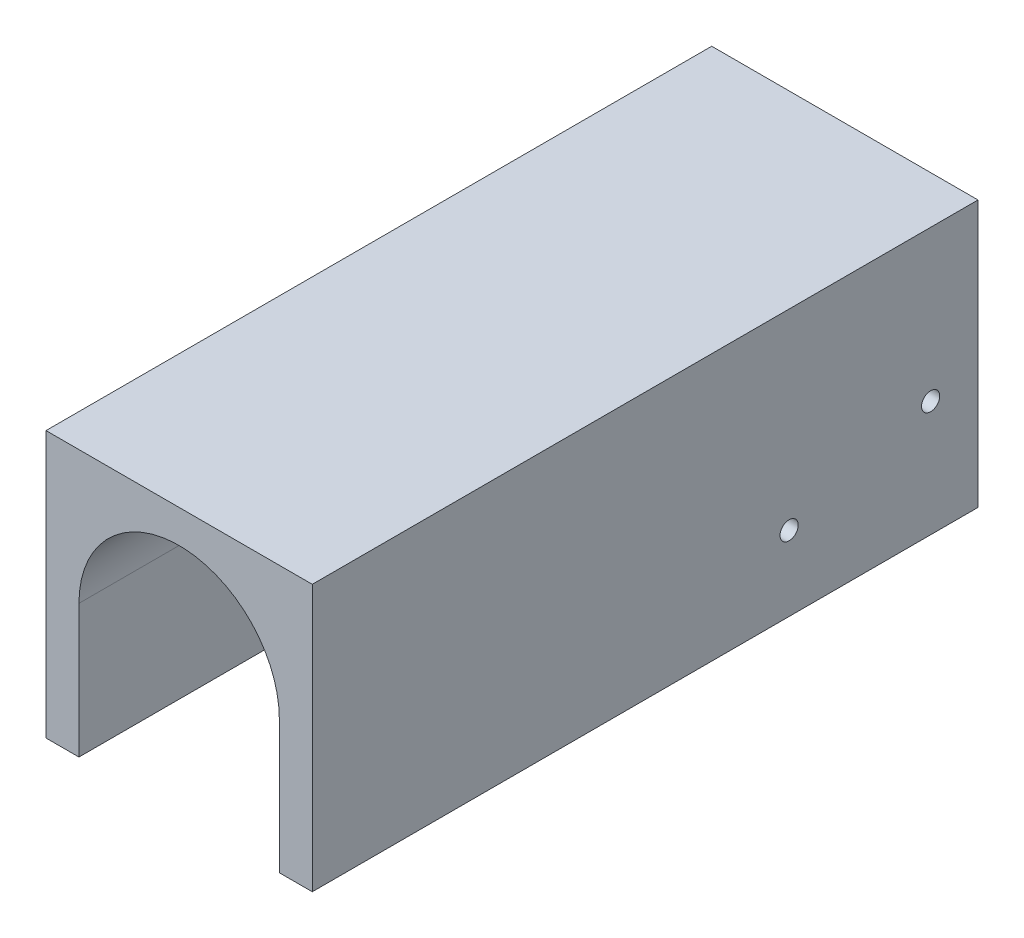
ISO-10303-21;
HEADER;
FILE_DESCRIPTION(('STEP AP214'),'2;1');
FILE_NAME('part.step','',(''),(''),'','','');
FILE_SCHEMA(('AUTOMOTIVE_DESIGN { 1 0 10303 214 1 1 1 1 }'));
ENDSEC;
DATA;
#1=APPLICATION_CONTEXT('core data for automotive mechanical design processes');
#2=APPLICATION_PROTOCOL_DEFINITION('international standard','automotive_design',2000,#1);
#3=PRODUCT_CONTEXT('',#1,'mechanical');
#4=PRODUCT('Part','Part','',(#3));
#5=PRODUCT_RELATED_PRODUCT_CATEGORY('part','',(#4));
#6=PRODUCT_DEFINITION_FORMATION('','',#4);
#7=PRODUCT_DEFINITION_CONTEXT('part definition',#1,'design');
#8=PRODUCT_DEFINITION('design','',#6,#7);
#9=PRODUCT_DEFINITION_SHAPE('','',#8);
#10=(LENGTH_UNIT() NAMED_UNIT(*) SI_UNIT(.MILLI.,.METRE.));
#11=(NAMED_UNIT(*) PLANE_ANGLE_UNIT() SI_UNIT($,.RADIAN.));
#12=(NAMED_UNIT(*) SI_UNIT($,.STERADIAN.) SOLID_ANGLE_UNIT());
#13=UNCERTAINTY_MEASURE_WITH_UNIT(LENGTH_MEASURE(1.E-05),#10,'distance_accuracy_value','');
#14=(GEOMETRIC_REPRESENTATION_CONTEXT(3) GLOBAL_UNCERTAINTY_ASSIGNED_CONTEXT((#13)) GLOBAL_UNIT_ASSIGNED_CONTEXT((#10,
#11,#12)) REPRESENTATION_CONTEXT('',''));
#15=CARTESIAN_POINT('',(0.,0.,0.));
#16=DIRECTION('',(0.,0.,1.));
#17=DIRECTION('',(1.,0.,0.));
#18=AXIS2_PLACEMENT_3D('',#15,#16,#17);
#19=CARTESIAN_POINT('',(30.,0.,0.));
#20=DIRECTION('',(0.,0.,-1.));
#21=DIRECTION('',(-1.,0.,0.));
#22=AXIS2_PLACEMENT_3D('',#19,#20,#21);
#23=PLANE('',#22);
#24=CARTESIAN_POINT('',(0.,-30.,0.));
#25=DIRECTION('',(0.,0.,1.));
#26=DIRECTION('',(1.,0.,0.));
#27=AXIS2_PLACEMENT_3D('',#24,#25,#26);
#28=CIRCLE('',#27,22.575);
#29=CARTESIAN_POINT('',(22.575,-30.,0.));
#30=VERTEX_POINT('',#29);
#31=CARTESIAN_POINT('',(-22.575,-30.,0.));
#32=VERTEX_POINT('',#31);
#33=EDGE_CURVE('E112',#30,#32,#28,.T.);
#34=ORIENTED_EDGE('',*,*,#33,.F.);
#35=DIRECTION('',(0.,1.,0.));
#36=VECTOR('',#35,1.);
#37=CARTESIAN_POINT('',(22.575,-60.,0.));
#38=LINE('',#37,#36);
#39=CARTESIAN_POINT('',(22.575,-60.,0.));
#40=VERTEX_POINT('',#39);
#41=EDGE_CURVE('E125',#40,#30,#38,.T.);
#42=ORIENTED_EDGE('',*,*,#41,.F.);
#43=DIRECTION('',(-1.,0.,0.));
#44=VECTOR('',#43,1.);
#45=CARTESIAN_POINT('',(30.,-60.,0.));
#46=LINE('',#45,#44);
#47=CARTESIAN_POINT('',(30.,-60.,0.));
#48=VERTEX_POINT('',#47);
#49=EDGE_CURVE('E11',#48,#40,#46,.T.);
#50=ORIENTED_EDGE('',*,*,#49,.F.);
#51=DIRECTION('',(0.,-1.,0.));
#52=VECTOR('',#51,1.);
#53=CARTESIAN_POINT('',(30.,0.,0.));
#54=LINE('',#53,#52);
#55=CARTESIAN_POINT('',(30.,0.,0.));
#56=VERTEX_POINT('',#55);
#57=EDGE_CURVE('E144',#56,#48,#54,.T.);
#58=ORIENTED_EDGE('',*,*,#57,.F.);
#59=DIRECTION('',(-1.,0.,0.));
#60=VECTOR('',#59,1.);
#61=CARTESIAN_POINT('',(30.,0.,0.));
#62=LINE('',#61,#60);
#63=CARTESIAN_POINT('',(-30.,0.,0.));
#64=VERTEX_POINT('',#63);
#65=EDGE_CURVE('E150',#56,#64,#62,.T.);
#66=ORIENTED_EDGE('',*,*,#65,.T.);
#67=DIRECTION('',(0.,-1.,0.));
#68=VECTOR('',#67,1.);
#69=CARTESIAN_POINT('',(-30.,0.,0.));
#70=LINE('',#69,#68);
#71=CARTESIAN_POINT('',(-30.,-60.,0.));
#72=VERTEX_POINT('',#71);
#73=EDGE_CURVE('E140',#64,#72,#70,.T.);
#74=ORIENTED_EDGE('',*,*,#73,.T.);
#75=CARTESIAN_POINT('',(-22.575,-60.,0.));
#76=VERTEX_POINT('',#75);
#77=EDGE_CURVE('E40',#76,#72,#46,.T.);
#78=ORIENTED_EDGE('',*,*,#77,.F.);
#79=DIRECTION('',(0.,-1.,0.));
#80=VECTOR('',#79,1.);
#81=CARTESIAN_POINT('',(-22.575,-30.,0.));
#82=LINE('',#81,#80);
#83=EDGE_CURVE('E128',#32,#76,#82,.T.);
#84=ORIENTED_EDGE('',*,*,#83,.F.);
#85=EDGE_LOOP('',(#34,#42,#50,#58,#66,#74,#78,#84));
#86=FACE_BOUND('',#85,.T.);
#87=ADVANCED_FACE('F33',(#86),#23,.F.);
#88=CARTESIAN_POINT('',(30.,-60.,0.));
#89=DIRECTION('',(0.,1.,0.));
#90=DIRECTION('',(0.,0.,1.));
#91=AXIS2_PLACEMENT_3D('',#88,#89,#90);
#92=PLANE('',#91);
#93=ORIENTED_EDGE('',*,*,#49,.T.);
#94=DIRECTION('',(0.,0.,1.));
#95=VECTOR('',#94,1.);
#96=CARTESIAN_POINT('',(22.575,-60.,-100.));
#97=LINE('',#96,#95);
#98=CARTESIAN_POINT('',(22.575,-60.,-100.));
#99=VERTEX_POINT('',#98);
#100=EDGE_CURVE('E141',#99,#40,#97,.T.);
#101=ORIENTED_EDGE('',*,*,#100,.F.);
#102=DIRECTION('',(1.,0.,0.));
#103=VECTOR('',#102,1.);
#104=CARTESIAN_POINT('',(-22.575,-60.,-100.));
#105=LINE('',#104,#103);
#106=CARTESIAN_POINT('',(-22.575,-60.,-100.));
#107=VERTEX_POINT('',#106);
#108=EDGE_CURVE('E121',#107,#99,#105,.T.);
#109=ORIENTED_EDGE('',*,*,#108,.F.);
#110=DIRECTION('',(0.,0.,1.));
#111=VECTOR('',#110,1.);
#112=CARTESIAN_POINT('',(-22.575,-60.,-100.));
#113=LINE('',#112,#111);
#114=EDGE_CURVE('E115',#107,#76,#113,.T.);
#115=ORIENTED_EDGE('',*,*,#114,.T.);
#116=ORIENTED_EDGE('',*,*,#77,.T.);
#117=DIRECTION('',(0.,0.,-1.));
#118=VECTOR('',#117,1.);
#119=CARTESIAN_POINT('',(-30.,-60.,0.));
#120=LINE('',#119,#118);
#121=CARTESIAN_POINT('',(-30.,-60.,-150.));
#122=VERTEX_POINT('',#121);
#123=EDGE_CURVE('E153',#72,#122,#120,.T.);
#124=ORIENTED_EDGE('',*,*,#123,.T.);
#125=DIRECTION('',(-1.,0.,0.));
#126=VECTOR('',#125,1.);
#127=CARTESIAN_POINT('',(30.,-60.,-150.));
#128=LINE('',#127,#126);
#129=CARTESIAN_POINT('',(30.,-60.,-150.));
#130=VERTEX_POINT('',#129);
#131=EDGE_CURVE('E160',#130,#122,#128,.T.);
#132=ORIENTED_EDGE('',*,*,#131,.F.);
#133=DIRECTION('',(0.,0.,-1.));
#134=VECTOR('',#133,1.);
#135=CARTESIAN_POINT('',(30.,-60.,0.));
#136=LINE('',#135,#134);
#137=EDGE_CURVE('E84',#48,#130,#136,.T.);
#138=ORIENTED_EDGE('',*,*,#137,.F.);
#139=EDGE_LOOP('',(#93,#101,#109,#115,#116,#124,#132,#138));
#140=FACE_BOUND('',#139,.T.);
#141=ADVANCED_FACE('F167',(#140),#92,.F.);
#142=CARTESIAN_POINT('',(30.,0.,-150.));
#143=DIRECTION('',(0.,0.,1.));
#144=DIRECTION('',(1.,0.,0.));
#145=AXIS2_PLACEMENT_3D('',#142,#143,#144);
#146=PLANE('',#145);
#147=DIRECTION('',(0.,1.,0.));
#148=VECTOR('',#147,1.);
#149=CARTESIAN_POINT('',(-30.,0.,-150.));
#150=LINE('',#149,#148);
#151=CARTESIAN_POINT('',(-30.,0.,-150.));
#152=VERTEX_POINT('',#151);
#153=EDGE_CURVE('E155',#122,#152,#150,.T.);
#154=ORIENTED_EDGE('',*,*,#153,.T.);
#155=DIRECTION('',(-1.,0.,0.));
#156=VECTOR('',#155,1.);
#157=CARTESIAN_POINT('',(30.,0.,-150.));
#158=LINE('',#157,#156);
#159=CARTESIAN_POINT('',(30.,0.,-150.));
#160=VERTEX_POINT('',#159);
#161=EDGE_CURVE('E159',#160,#152,#158,.T.);
#162=ORIENTED_EDGE('',*,*,#161,.F.);
#163=DIRECTION('',(0.,1.,0.));
#164=VECTOR('',#163,1.);
#165=CARTESIAN_POINT('',(30.,0.,-150.));
#166=LINE('',#165,#164);
#167=EDGE_CURVE('E147',#130,#160,#166,.T.);
#168=ORIENTED_EDGE('',*,*,#167,.F.);
#169=ORIENTED_EDGE('',*,*,#131,.T.);
#170=EDGE_LOOP('',(#154,#162,#168,#169));
#171=FACE_BOUND('',#170,.T.);
#172=ADVANCED_FACE('F176',(#171),#146,.F.);
#173=CARTESIAN_POINT('',(30.,0.,0.));
#174=DIRECTION('',(0.,-1.,0.));
#175=DIRECTION('',(0.,0.,-1.));
#176=AXIS2_PLACEMENT_3D('',#173,#174,#175);
#177=PLANE('',#176);
#178=DIRECTION('',(0.,0.,1.));
#179=VECTOR('',#178,1.);
#180=CARTESIAN_POINT('',(-30.,0.,0.));
#181=LINE('',#180,#179);
#182=EDGE_CURVE('E77',#152,#64,#181,.T.);
#183=ORIENTED_EDGE('',*,*,#182,.T.);
#184=ORIENTED_EDGE('',*,*,#65,.F.);
#185=DIRECTION('',(0.,0.,1.));
#186=VECTOR('',#185,1.);
#187=CARTESIAN_POINT('',(30.,0.,0.));
#188=LINE('',#187,#186);
#189=EDGE_CURVE('E56',#160,#56,#188,.T.);
#190=ORIENTED_EDGE('',*,*,#189,.F.);
#191=ORIENTED_EDGE('',*,*,#161,.T.);
#192=EDGE_LOOP('',(#183,#184,#190,#191));
#193=FACE_BOUND('',#192,.T.);
#194=ADVANCED_FACE('F174',(#193),#177,.F.);
#195=CARTESIAN_POINT('',(30.,0.,0.));
#196=DIRECTION('',(1.,0.,0.));
#197=DIRECTION('',(0.,0.,-1.));
#198=AXIS2_PLACEMENT_3D('',#195,#196,#197);
#199=PLANE('',#198);
#200=CARTESIAN_POINT('',(30.,-33.9391232566804,-139.331395940552));
#201=DIRECTION('',(1.,0.,0.));
#202=DIRECTION('',(0.,0.,-1.));
#203=AXIS2_PLACEMENT_3D('',#200,#201,#202);
#204=CIRCLE('',#203,2.04999999999999);
#205=CARTESIAN_POINT('',(30.,-33.9391232566804,-141.381395940552));
#206=VERTEX_POINT('',#205);
#207=EDGE_CURVE('E212',#206,#206,#204,.T.);
#208=ORIENTED_EDGE('',*,*,#207,.F.);
#209=EDGE_LOOP('',(#208));
#210=FACE_BOUND('',#209,.T.);
#211=CARTESIAN_POINT('',(30.,-43.1747878457662,-107.446436281849));
#212=DIRECTION('',(1.,0.,0.));
#213=DIRECTION('',(0.,0.,-1.));
#214=AXIS2_PLACEMENT_3D('',#211,#212,#213);
#215=CIRCLE('',#214,2.04999999999999);
#216=CARTESIAN_POINT('',(30.,-43.1747878457662,-109.496436281849));
#217=VERTEX_POINT('',#216);
#218=EDGE_CURVE('E215',#217,#217,#215,.T.);
#219=ORIENTED_EDGE('',*,*,#218,.F.);
#220=EDGE_LOOP('',(#219));
#221=FACE_BOUND('',#220,.T.);
#222=ORIENTED_EDGE('',*,*,#57,.T.);
#223=ORIENTED_EDGE('',*,*,#137,.T.);
#224=ORIENTED_EDGE('',*,*,#167,.T.);
#225=ORIENTED_EDGE('',*,*,#189,.T.);
#226=EDGE_LOOP('',(#222,#223,#224,#225));
#227=FACE_BOUND('',#226,.T.);
#228=ADVANCED_FACE('F177',(#210,#221,#227),#199,.T.);
#229=CARTESIAN_POINT('',(-30.,0.,0.));
#230=DIRECTION('',(1.,0.,0.));
#231=DIRECTION('',(0.,0.,-1.));
#232=AXIS2_PLACEMENT_3D('',#229,#230,#231);
#233=PLANE('',#232);
#234=CARTESIAN_POINT('',(-30.,-33.9391232566804,-139.331395940552));
#235=DIRECTION('',(1.,0.,0.));
#236=DIRECTION('',(0.,0.,-1.));
#237=AXIS2_PLACEMENT_3D('',#234,#235,#236);
#238=CIRCLE('',#237,2.04999999999999);
#239=CARTESIAN_POINT('',(-30.,-33.9391232566804,-141.381395940552));
#240=VERTEX_POINT('',#239);
#241=EDGE_CURVE('E217',#240,#240,#238,.T.);
#242=ORIENTED_EDGE('',*,*,#241,.T.);
#243=EDGE_LOOP('',(#242));
#244=FACE_BOUND('',#243,.T.);
#245=CARTESIAN_POINT('',(-30.,-43.1747878457662,-107.446436281849));
#246=DIRECTION('',(1.,0.,0.));
#247=DIRECTION('',(0.,0.,-1.));
#248=AXIS2_PLACEMENT_3D('',#245,#246,#247);
#249=CIRCLE('',#248,2.04999999999999);
#250=CARTESIAN_POINT('',(-30.,-43.1747878457662,-109.496436281849));
#251=VERTEX_POINT('',#250);
#252=EDGE_CURVE('E131',#251,#251,#249,.T.);
#253=ORIENTED_EDGE('',*,*,#252,.T.);
#254=EDGE_LOOP('',(#253));
#255=FACE_BOUND('',#254,.T.);
#256=ORIENTED_EDGE('',*,*,#73,.F.);
#257=ORIENTED_EDGE('',*,*,#182,.F.);
#258=ORIENTED_EDGE('',*,*,#153,.F.);
#259=ORIENTED_EDGE('',*,*,#123,.F.);
#260=EDGE_LOOP('',(#256,#257,#258,#259));
#261=FACE_BOUND('',#260,.T.);
#262=ADVANCED_FACE('F171',(#244,#255,#261),#233,.F.);
#263=CARTESIAN_POINT('',(0.,-30.,-100.));
#264=DIRECTION('',(0.,0.,1.));
#265=DIRECTION('',(1.,0.,0.));
#266=AXIS2_PLACEMENT_3D('',#263,#264,#265);
#267=CYLINDRICAL_SURFACE('',#266,22.575);
#268=ORIENTED_EDGE('',*,*,#33,.T.);
#269=DIRECTION('',(0.,0.,1.));
#270=VECTOR('',#269,1.);
#271=CARTESIAN_POINT('',(-22.575,-30.,-100.));
#272=LINE('',#271,#270);
#273=CARTESIAN_POINT('',(-22.575,-30.,-100.));
#274=VERTEX_POINT('',#273);
#275=EDGE_CURVE('E107',#274,#32,#272,.T.);
#276=ORIENTED_EDGE('',*,*,#275,.F.);
#277=CARTESIAN_POINT('',(0.,-30.,-100.));
#278=DIRECTION('',(0.,0.,1.));
#279=DIRECTION('',(1.,0.,0.));
#280=AXIS2_PLACEMENT_3D('',#277,#278,#279);
#281=CIRCLE('',#280,22.575);
#282=CARTESIAN_POINT('',(22.575,-30.,-100.));
#283=VERTEX_POINT('',#282);
#284=EDGE_CURVE('E109',#283,#274,#281,.T.);
#285=ORIENTED_EDGE('',*,*,#284,.F.);
#286=DIRECTION('',(0.,0.,1.));
#287=VECTOR('',#286,1.);
#288=CARTESIAN_POINT('',(22.575,-30.,-100.));
#289=LINE('',#288,#287);
#290=EDGE_CURVE('E138',#283,#30,#289,.T.);
#291=ORIENTED_EDGE('',*,*,#290,.T.);
#292=EDGE_LOOP('',(#268,#276,#285,#291));
#293=FACE_BOUND('',#292,.T.);
#294=ADVANCED_FACE('F108',(#293),#267,.F.);
#295=CARTESIAN_POINT('',(22.575,-60.,-100.));
#296=DIRECTION('',(1.,0.,0.));
#297=DIRECTION('',(0.,1.,0.));
#298=AXIS2_PLACEMENT_3D('',#295,#296,#297);
#299=PLANE('',#298);
#300=ORIENTED_EDGE('',*,*,#41,.T.);
#301=ORIENTED_EDGE('',*,*,#290,.F.);
#302=DIRECTION('',(0.,1.,0.));
#303=VECTOR('',#302,1.);
#304=CARTESIAN_POINT('',(22.575,-60.,-100.));
#305=LINE('',#304,#303);
#306=EDGE_CURVE('E116',#99,#283,#305,.T.);
#307=ORIENTED_EDGE('',*,*,#306,.F.);
#308=ORIENTED_EDGE('',*,*,#100,.T.);
#309=EDGE_LOOP('',(#300,#301,#307,#308));
#310=FACE_BOUND('',#309,.T.);
#311=ADVANCED_FACE('F181',(#310),#299,.F.);
#312=CARTESIAN_POINT('',(-22.575,-30.,-100.));
#313=DIRECTION('',(-1.,0.,0.));
#314=DIRECTION('',(0.,-1.,0.));
#315=AXIS2_PLACEMENT_3D('',#312,#313,#314);
#316=PLANE('',#315);
#317=ORIENTED_EDGE('',*,*,#83,.T.);
#318=ORIENTED_EDGE('',*,*,#114,.F.);
#319=DIRECTION('',(0.,-1.,0.));
#320=VECTOR('',#319,1.);
#321=CARTESIAN_POINT('',(-22.575,-30.,-100.));
#322=LINE('',#321,#320);
#323=EDGE_CURVE('E47',#274,#107,#322,.T.);
#324=ORIENTED_EDGE('',*,*,#323,.F.);
#325=ORIENTED_EDGE('',*,*,#275,.T.);
#326=EDGE_LOOP('',(#317,#318,#324,#325));
#327=FACE_BOUND('',#326,.T.);
#328=ADVANCED_FACE('F118',(#327),#316,.F.);
#329=CARTESIAN_POINT('',(0.,-30.,-100.));
#330=DIRECTION('',(0.,0.,1.));
#331=DIRECTION('',(1.,0.,0.));
#332=AXIS2_PLACEMENT_3D('',#329,#330,#331);
#333=PLANE('',#332);
#334=ORIENTED_EDGE('',*,*,#284,.T.);
#335=ORIENTED_EDGE('',*,*,#323,.T.);
#336=ORIENTED_EDGE('',*,*,#108,.T.);
#337=ORIENTED_EDGE('',*,*,#306,.T.);
#338=EDGE_LOOP('',(#334,#335,#336,#337));
#339=FACE_BOUND('',#338,.T.);
#340=ADVANCED_FACE('F123',(#339),#333,.T.);
#341=CARTESIAN_POINT('',(-30.,-43.1747878457662,-107.446436281849));
#342=DIRECTION('',(1.,0.,0.));
#343=DIRECTION('',(0.,0.,-1.));
#344=AXIS2_PLACEMENT_3D('',#341,#342,#343);
#345=CYLINDRICAL_SURFACE('',#344,2.04999999999999);
#346=ORIENTED_EDGE('',*,*,#252,.F.);
#347=EDGE_LOOP('',(#346));
#348=FACE_BOUND('',#347,.T.);
#349=ORIENTED_EDGE('',*,*,#218,.T.);
#350=EDGE_LOOP('',(#349));
#351=FACE_BOUND('',#350,.T.);
#352=ADVANCED_FACE('F225',(#348,#351),#345,.F.);
#353=CARTESIAN_POINT('',(-30.,-33.9391232566804,-139.331395940552));
#354=DIRECTION('',(1.,0.,0.));
#355=DIRECTION('',(0.,0.,-1.));
#356=AXIS2_PLACEMENT_3D('',#353,#354,#355);
#357=CYLINDRICAL_SURFACE('',#356,2.04999999999999);
#358=ORIENTED_EDGE('',*,*,#241,.F.);
#359=EDGE_LOOP('',(#358));
#360=FACE_BOUND('',#359,.T.);
#361=ORIENTED_EDGE('',*,*,#207,.T.);
#362=EDGE_LOOP('',(#361));
#363=FACE_BOUND('',#362,.T.);
#364=ADVANCED_FACE('F223',(#360,#363),#357,.F.);
#365=CLOSED_SHELL('',(#87,#141,#172,#194,#228,#262,#294,#311,#328,#340,#352,#364));
#366=MANIFOLD_SOLID_BREP('B2',#365);
#367=ADVANCED_BREP_SHAPE_REPRESENTATION('',(#18,#366),#14);
#368=SHAPE_DEFINITION_REPRESENTATION(#9,#367);
ENDSEC;
END-ISO-10303-21;
